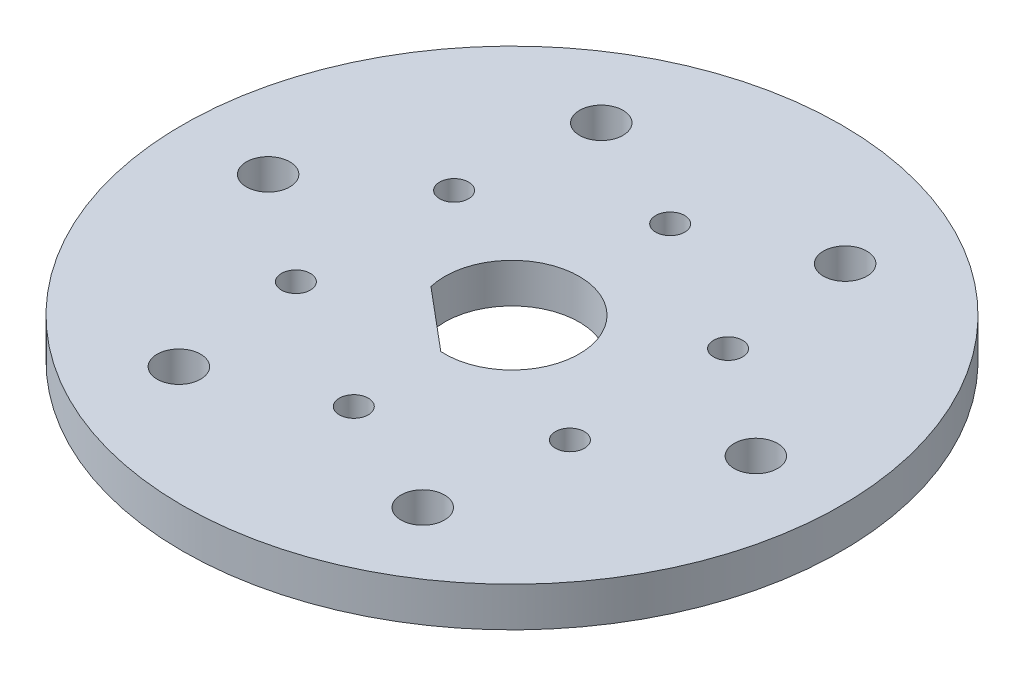
ISO-10303-21;
HEADER;
FILE_DESCRIPTION(('STEP AP214'),'2;1');
FILE_NAME('part.step','',(''),(''),'','','');
FILE_SCHEMA(('AUTOMOTIVE_DESIGN { 1 0 10303 214 1 1 1 1 }'));
ENDSEC;
DATA;
#1=APPLICATION_CONTEXT('core data for automotive mechanical design processes');
#2=APPLICATION_PROTOCOL_DEFINITION('international standard','automotive_design',2000,#1);
#3=PRODUCT_CONTEXT('',#1,'mechanical');
#4=PRODUCT('Part','Part','',(#3));
#5=PRODUCT_RELATED_PRODUCT_CATEGORY('part','',(#4));
#6=PRODUCT_DEFINITION_FORMATION('','',#4);
#7=PRODUCT_DEFINITION_CONTEXT('part definition',#1,'design');
#8=PRODUCT_DEFINITION('design','',#6,#7);
#9=PRODUCT_DEFINITION_SHAPE('','',#8);
#10=(LENGTH_UNIT() NAMED_UNIT(*) SI_UNIT(.MILLI.,.METRE.));
#11=(NAMED_UNIT(*) PLANE_ANGLE_UNIT() SI_UNIT($,.RADIAN.));
#12=(NAMED_UNIT(*) SI_UNIT($,.STERADIAN.) SOLID_ANGLE_UNIT());
#13=UNCERTAINTY_MEASURE_WITH_UNIT(LENGTH_MEASURE(1.E-05),#10,'distance_accuracy_value','');
#14=(GEOMETRIC_REPRESENTATION_CONTEXT(3) GLOBAL_UNCERTAINTY_ASSIGNED_CONTEXT((#13)) GLOBAL_UNIT_ASSIGNED_CONTEXT((#10,
#11,#12)) REPRESENTATION_CONTEXT('',''));
#15=CARTESIAN_POINT('',(0.,0.,0.));
#16=DIRECTION('',(0.,0.,1.));
#17=DIRECTION('',(1.,0.,0.));
#18=AXIS2_PLACEMENT_3D('',#15,#16,#17);
#19=CARTESIAN_POINT('',(0.,3.,0.));
#20=DIRECTION('',(0.,1.,0.));
#21=DIRECTION('',(0.,0.,1.));
#22=AXIS2_PLACEMENT_3D('',#19,#20,#21);
#23=PLANE('',#22);
#24=CARTESIAN_POINT('',(-10.3923048454127,3.,-5.99999999999955));
#25=DIRECTION('',(0.,1.,0.));
#26=DIRECTION('',(0.,0.,1.));
#27=AXIS2_PLACEMENT_3D('',#24,#25,#26);
#28=CIRCLE('',#27,1.1);
#29=CARTESIAN_POINT('',(-10.3923048454127,3.,-4.89999999999955));
#30=VERTEX_POINT('',#29);
#31=EDGE_CURVE('E121',#30,#30,#28,.T.);
#32=ORIENTED_EDGE('',*,*,#31,.F.);
#33=EDGE_LOOP('',(#32));
#34=FACE_BOUND('',#33,.T.);
#35=CARTESIAN_POINT('',(-10.3923048454121,3.,6.00000000000035));
#36=DIRECTION('',(0.,1.,0.));
#37=DIRECTION('',(0.,0.,1.));
#38=AXIS2_PLACEMENT_3D('',#35,#36,#37);
#39=CIRCLE('',#38,1.1);
#40=CARTESIAN_POINT('',(-10.3923048454121,3.,7.10000000000035));
#41=VERTEX_POINT('',#40);
#42=EDGE_CURVE('E125',#41,#41,#39,.T.);
#43=ORIENTED_EDGE('',*,*,#42,.F.);
#44=EDGE_LOOP('',(#43));
#45=FACE_BOUND('',#44,.T.);
#46=CARTESIAN_POINT('',(1.33226762955019E-12,3.,11.9999999999997));
#47=DIRECTION('',(0.,1.,0.));
#48=DIRECTION('',(0.,0.,1.));
#49=AXIS2_PLACEMENT_3D('',#46,#47,#48);
#50=CIRCLE('',#49,1.1);
#51=CARTESIAN_POINT('',(1.33226762955019E-12,3.,13.0999999999997));
#52=VERTEX_POINT('',#51);
#53=EDGE_CURVE('E129',#52,#52,#50,.T.);
#54=ORIENTED_EDGE('',*,*,#53,.F.);
#55=EDGE_LOOP('',(#54));
#56=FACE_BOUND('',#55,.T.);
#57=CARTESIAN_POINT('',(10.3923048454142,3.,5.99999999999924));
#58=DIRECTION('',(0.,1.,0.));
#59=DIRECTION('',(0.,0.,1.));
#60=AXIS2_PLACEMENT_3D('',#57,#58,#59);
#61=CIRCLE('',#60,1.1);
#62=CARTESIAN_POINT('',(10.3923048454142,3.,7.09999999999924));
#63=VERTEX_POINT('',#62);
#64=EDGE_CURVE('E133',#63,#63,#61,.T.);
#65=ORIENTED_EDGE('',*,*,#64,.F.);
#66=EDGE_LOOP('',(#65));
#67=FACE_BOUND('',#66,.T.);
#68=CARTESIAN_POINT('',(10.3923048454136,3.,-6.00000000000066));
#69=DIRECTION('',(0.,1.,0.));
#70=DIRECTION('',(0.,0.,1.));
#71=AXIS2_PLACEMENT_3D('',#68,#69,#70);
#72=CIRCLE('',#71,1.1);
#73=CARTESIAN_POINT('',(10.3923048454136,3.,-4.90000000000066));
#74=VERTEX_POINT('',#73);
#75=EDGE_CURVE('E75',#74,#74,#72,.T.);
#76=ORIENTED_EDGE('',*,*,#75,.F.);
#77=EDGE_LOOP('',(#76));
#78=FACE_BOUND('',#77,.T.);
#79=CARTESIAN_POINT('',(0.,3.,-12.));
#80=DIRECTION('',(0.,1.,0.));
#81=DIRECTION('',(0.,0.,1.));
#82=AXIS2_PLACEMENT_3D('',#79,#80,#81);
#83=CIRCLE('',#82,1.1);
#84=CARTESIAN_POINT('',(0.,3.,-10.9));
#85=VERTEX_POINT('',#84);
#86=EDGE_CURVE('E91',#85,#85,#83,.T.);
#87=ORIENTED_EDGE('',*,*,#86,.F.);
#88=EDGE_LOOP('',(#87));
#89=FACE_BOUND('',#88,.T.);
#90=CARTESIAN_POINT('',(0.,3.,0.));
#91=DIRECTION('',(0.,1.,0.));
#92=DIRECTION('',(0.,0.,1.));
#93=AXIS2_PLACEMENT_3D('',#90,#91,#92);
#94=CIRCLE('',#93,25.);
#95=CARTESIAN_POINT('',(0.,3.,25.));
#96=VERTEX_POINT('',#95);
#97=EDGE_CURVE('E11',#96,#96,#94,.T.);
#98=ORIENTED_EDGE('',*,*,#97,.T.);
#99=EDGE_LOOP('',(#98));
#100=FACE_BOUND('',#99,.T.);
#101=CARTESIAN_POINT('',(-9.25000000001397,3.,-16.0214699700021));
#102=DIRECTION('',(0.,1.,0.));
#103=DIRECTION('',(0.,0.,1.));
#104=AXIS2_PLACEMENT_3D('',#101,#102,#103);
#105=CIRCLE('',#104,1.65);
#106=CARTESIAN_POINT('',(-9.25000000001397,3.,-14.3714699700021));
#107=VERTEX_POINT('',#106);
#108=EDGE_CURVE('E85',#107,#107,#105,.T.);
#109=ORIENTED_EDGE('',*,*,#108,.F.);
#110=EDGE_LOOP('',(#109));
#111=FACE_BOUND('',#110,.T.);
#112=DIRECTION('',(0.766044443118973,0.,0.642787609686545));
#113=VECTOR('',#112,1.);
#114=CARTESIAN_POINT('',(-4.95895703842243,3.,1.19111086431126));
#115=LINE('',#114,#113);
#116=CARTESIAN_POINT('',(-4.95895703842243,3.,1.19111086431126));
#117=VERTEX_POINT('',#116);
#118=CARTESIAN_POINT('',(-0.311901361020173,3.,5.09045356927983));
#119=VERTEX_POINT('',#118);
#120=EDGE_CURVE('E81',#117,#119,#115,.T.);
#121=ORIENTED_EDGE('',*,*,#120,.F.);
#122=CARTESIAN_POINT('',(0.,3.,0.));
#123=DIRECTION('',(0.,1.,0.));
#124=DIRECTION('',(0.,0.,1.));
#125=AXIS2_PLACEMENT_3D('',#122,#123,#124);
#126=CIRCLE('',#125,5.09999999999998);
#127=EDGE_CURVE('E66',#119,#117,#126,.T.);
#128=ORIENTED_EDGE('',*,*,#127,.F.);
#129=EDGE_LOOP('',(#121,#128));
#130=FACE_BOUND('',#129,.T.);
#131=CARTESIAN_POINT('',(9.24999999998462,3.,-16.0214699700199));
#132=DIRECTION('',(0.,1.,0.));
#133=DIRECTION('',(0.,0.,1.));
#134=AXIS2_PLACEMENT_3D('',#131,#132,#133);
#135=CIRCLE('',#134,1.65);
#136=CARTESIAN_POINT('',(9.24999999998462,3.,-14.3714699700199));
#137=VERTEX_POINT('',#136);
#138=EDGE_CURVE('E146',#137,#137,#135,.T.);
#139=ORIENTED_EDGE('',*,*,#138,.F.);
#140=EDGE_LOOP('',(#139));
#141=FACE_BOUND('',#140,.T.);
#142=CARTESIAN_POINT('',(18.4999999999993,3.,-1.78329573330416E-11));
#143=DIRECTION('',(0.,1.,0.));
#144=DIRECTION('',(0.,0.,1.));
#145=AXIS2_PLACEMENT_3D('',#142,#143,#144);
#146=CIRCLE('',#145,1.65);
#147=CARTESIAN_POINT('',(18.4999999999993,3.,1.64999999998217));
#148=VERTEX_POINT('',#147);
#149=EDGE_CURVE('E150',#148,#148,#146,.T.);
#150=ORIENTED_EDGE('',*,*,#149,.F.);
#151=EDGE_LOOP('',(#150));
#152=FACE_BOUND('',#151,.T.);
#153=CARTESIAN_POINT('',(9.25000000001527,3.,16.0214699700019));
#154=DIRECTION('',(0.,1.,0.));
#155=DIRECTION('',(0.,0.,1.));
#156=AXIS2_PLACEMENT_3D('',#153,#154,#155);
#157=CIRCLE('',#156,1.65);
#158=CARTESIAN_POINT('',(9.25000000001527,3.,17.6714699700019));
#159=VERTEX_POINT('',#158);
#160=EDGE_CURVE('E154',#159,#159,#157,.T.);
#161=ORIENTED_EDGE('',*,*,#160,.F.);
#162=EDGE_LOOP('',(#161));
#163=FACE_BOUND('',#162,.T.);
#164=CARTESIAN_POINT('',(-9.24999999998327,3.,16.0214699700195));
#165=DIRECTION('',(0.,1.,0.));
#166=DIRECTION('',(0.,0.,1.));
#167=AXIS2_PLACEMENT_3D('',#164,#165,#166);
#168=CIRCLE('',#167,1.65);
#169=CARTESIAN_POINT('',(-9.24999999998327,3.,17.6714699700196));
#170=VERTEX_POINT('',#169);
#171=EDGE_CURVE('E158',#170,#170,#168,.T.);
#172=ORIENTED_EDGE('',*,*,#171,.F.);
#173=EDGE_LOOP('',(#172));
#174=FACE_BOUND('',#173,.T.);
#175=CARTESIAN_POINT('',(-18.4999999999978,3.,1.74721348500384E-11));
#176=DIRECTION('',(0.,1.,0.));
#177=DIRECTION('',(0.,0.,1.));
#178=AXIS2_PLACEMENT_3D('',#175,#176,#177);
#179=CIRCLE('',#178,1.65);
#180=CARTESIAN_POINT('',(-18.4999999999978,3.,1.65000000001747));
#181=VERTEX_POINT('',#180);
#182=EDGE_CURVE('E161',#181,#181,#179,.T.);
#183=ORIENTED_EDGE('',*,*,#182,.F.);
#184=EDGE_LOOP('',(#183));
#185=FACE_BOUND('',#184,.T.);
#186=ADVANCED_FACE('F34',(#34,#45,#56,#67,#78,#89,#100,#111,#130,#141,#152,#163,#174,#185),#23,.T.);
#187=CARTESIAN_POINT('',(0.,0.,0.));
#188=DIRECTION('',(0.,1.,0.));
#189=DIRECTION('',(0.,0.,1.));
#190=AXIS2_PLACEMENT_3D('',#187,#188,#189);
#191=PLANE('',#190);
#192=CARTESIAN_POINT('',(-9.25000000001397,0.,-16.0214699700021));
#193=DIRECTION('',(0.,1.,0.));
#194=DIRECTION('',(0.,0.,1.));
#195=AXIS2_PLACEMENT_3D('',#192,#193,#194);
#196=CIRCLE('',#195,1.65);
#197=CARTESIAN_POINT('',(-9.25000000001397,0.,-14.3714699700021));
#198=VERTEX_POINT('',#197);
#199=EDGE_CURVE('E71',#198,#198,#196,.T.);
#200=ORIENTED_EDGE('',*,*,#199,.T.);
#201=EDGE_LOOP('',(#200));
#202=FACE_BOUND('',#201,.T.);
#203=CARTESIAN_POINT('',(0.,0.,-12.));
#204=DIRECTION('',(0.,1.,0.));
#205=DIRECTION('',(0.,0.,1.));
#206=AXIS2_PLACEMENT_3D('',#203,#204,#205);
#207=CIRCLE('',#206,1.1);
#208=CARTESIAN_POINT('',(0.,0.,-10.9));
#209=VERTEX_POINT('',#208);
#210=EDGE_CURVE('E88',#209,#209,#207,.T.);
#211=ORIENTED_EDGE('',*,*,#210,.T.);
#212=EDGE_LOOP('',(#211));
#213=FACE_BOUND('',#212,.T.);
#214=CARTESIAN_POINT('',(0.,0.,0.));
#215=DIRECTION('',(0.,1.,0.));
#216=DIRECTION('',(0.,0.,1.));
#217=AXIS2_PLACEMENT_3D('',#214,#215,#216);
#218=CIRCLE('',#217,25.);
#219=CARTESIAN_POINT('',(0.,0.,25.));
#220=VERTEX_POINT('',#219);
#221=EDGE_CURVE('E38',#220,#220,#218,.T.);
#222=ORIENTED_EDGE('',*,*,#221,.F.);
#223=EDGE_LOOP('',(#222));
#224=FACE_BOUND('',#223,.T.);
#225=CARTESIAN_POINT('',(0.,0.,0.));
#226=DIRECTION('',(0.,1.,0.));
#227=DIRECTION('',(0.,0.,1.));
#228=AXIS2_PLACEMENT_3D('',#225,#226,#227);
#229=CIRCLE('',#228,5.09999999999998);
#230=CARTESIAN_POINT('',(-0.311901361020173,0.,5.09045356927983));
#231=VERTEX_POINT('',#230);
#232=CARTESIAN_POINT('',(-4.95895703842243,0.,1.19111086431126));
#233=VERTEX_POINT('',#232);
#234=EDGE_CURVE('E56',#231,#233,#229,.T.);
#235=ORIENTED_EDGE('',*,*,#234,.T.);
#236=DIRECTION('',(0.766044443118973,0.,0.642787609686545));
#237=VECTOR('',#236,1.);
#238=CARTESIAN_POINT('',(-4.95895703842243,0.,1.19111086431126));
#239=LINE('',#238,#237);
#240=EDGE_CURVE('E62',#233,#231,#239,.T.);
#241=ORIENTED_EDGE('',*,*,#240,.T.);
#242=EDGE_LOOP('',(#235,#241));
#243=FACE_BOUND('',#242,.T.);
#244=CARTESIAN_POINT('',(10.3923048454136,0.,-6.00000000000066));
#245=DIRECTION('',(0.,1.,0.));
#246=DIRECTION('',(0.,0.,1.));
#247=AXIS2_PLACEMENT_3D('',#244,#245,#246);
#248=CIRCLE('',#247,1.1);
#249=CARTESIAN_POINT('',(10.3923048454136,0.,-4.90000000000066));
#250=VERTEX_POINT('',#249);
#251=EDGE_CURVE('E78',#250,#250,#248,.T.);
#252=ORIENTED_EDGE('',*,*,#251,.T.);
#253=EDGE_LOOP('',(#252));
#254=FACE_BOUND('',#253,.T.);
#255=CARTESIAN_POINT('',(9.24999999998462,0.,-16.0214699700199));
#256=DIRECTION('',(0.,1.,0.));
#257=DIRECTION('',(0.,0.,1.));
#258=AXIS2_PLACEMENT_3D('',#255,#256,#257);
#259=CIRCLE('',#258,1.65);
#260=CARTESIAN_POINT('',(9.24999999998462,0.,-14.3714699700199));
#261=VERTEX_POINT('',#260);
#262=EDGE_CURVE('E194',#261,#261,#259,.T.);
#263=ORIENTED_EDGE('',*,*,#262,.T.);
#264=EDGE_LOOP('',(#263));
#265=FACE_BOUND('',#264,.T.);
#266=CARTESIAN_POINT('',(10.3923048454142,0.,5.99999999999924));
#267=DIRECTION('',(0.,1.,0.));
#268=DIRECTION('',(0.,0.,1.));
#269=AXIS2_PLACEMENT_3D('',#266,#267,#268);
#270=CIRCLE('',#269,1.1);
#271=CARTESIAN_POINT('',(10.3923048454142,0.,7.09999999999924));
#272=VERTEX_POINT('',#271);
#273=EDGE_CURVE('E190',#272,#272,#270,.T.);
#274=ORIENTED_EDGE('',*,*,#273,.T.);
#275=EDGE_LOOP('',(#274));
#276=FACE_BOUND('',#275,.T.);
#277=CARTESIAN_POINT('',(18.4999999999993,0.,-1.78329573330416E-11));
#278=DIRECTION('',(0.,1.,0.));
#279=DIRECTION('',(0.,0.,1.));
#280=AXIS2_PLACEMENT_3D('',#277,#278,#279);
#281=CIRCLE('',#280,1.65);
#282=CARTESIAN_POINT('',(18.4999999999993,0.,1.64999999998217));
#283=VERTEX_POINT('',#282);
#284=EDGE_CURVE('E186',#283,#283,#281,.T.);
#285=ORIENTED_EDGE('',*,*,#284,.T.);
#286=EDGE_LOOP('',(#285));
#287=FACE_BOUND('',#286,.T.);
#288=CARTESIAN_POINT('',(1.33226762955019E-12,0.,11.9999999999997));
#289=DIRECTION('',(0.,1.,0.));
#290=DIRECTION('',(0.,0.,1.));
#291=AXIS2_PLACEMENT_3D('',#288,#289,#290);
#292=CIRCLE('',#291,1.1);
#293=CARTESIAN_POINT('',(1.33226762955019E-12,0.,13.0999999999997));
#294=VERTEX_POINT('',#293);
#295=EDGE_CURVE('E182',#294,#294,#292,.T.);
#296=ORIENTED_EDGE('',*,*,#295,.T.);
#297=EDGE_LOOP('',(#296));
#298=FACE_BOUND('',#297,.T.);
#299=CARTESIAN_POINT('',(9.25000000001527,0.,16.0214699700019));
#300=DIRECTION('',(0.,1.,0.));
#301=DIRECTION('',(0.,0.,1.));
#302=AXIS2_PLACEMENT_3D('',#299,#300,#301);
#303=CIRCLE('',#302,1.65);
#304=CARTESIAN_POINT('',(9.25000000001527,0.,17.6714699700019));
#305=VERTEX_POINT('',#304);
#306=EDGE_CURVE('E178',#305,#305,#303,.T.);
#307=ORIENTED_EDGE('',*,*,#306,.T.);
#308=EDGE_LOOP('',(#307));
#309=FACE_BOUND('',#308,.T.);
#310=CARTESIAN_POINT('',(-10.3923048454121,0.,6.00000000000035));
#311=DIRECTION('',(0.,1.,0.));
#312=DIRECTION('',(0.,0.,1.));
#313=AXIS2_PLACEMENT_3D('',#310,#311,#312);
#314=CIRCLE('',#313,1.1);
#315=CARTESIAN_POINT('',(-10.3923048454121,0.,7.10000000000035));
#316=VERTEX_POINT('',#315);
#317=EDGE_CURVE('E174',#316,#316,#314,.T.);
#318=ORIENTED_EDGE('',*,*,#317,.T.);
#319=EDGE_LOOP('',(#318));
#320=FACE_BOUND('',#319,.T.);
#321=CARTESIAN_POINT('',(-9.24999999998327,0.,16.0214699700195));
#322=DIRECTION('',(0.,1.,0.));
#323=DIRECTION('',(0.,0.,1.));
#324=AXIS2_PLACEMENT_3D('',#321,#322,#323);
#325=CIRCLE('',#324,1.65);
#326=CARTESIAN_POINT('',(-9.24999999998327,0.,17.6714699700196));
#327=VERTEX_POINT('',#326);
#328=EDGE_CURVE('E171',#327,#327,#325,.T.);
#329=ORIENTED_EDGE('',*,*,#328,.T.);
#330=EDGE_LOOP('',(#329));
#331=FACE_BOUND('',#330,.T.);
#332=CARTESIAN_POINT('',(-10.3923048454127,0.,-5.99999999999955));
#333=DIRECTION('',(0.,1.,0.));
#334=DIRECTION('',(0.,0.,1.));
#335=AXIS2_PLACEMENT_3D('',#332,#333,#334);
#336=CIRCLE('',#335,1.1);
#337=CARTESIAN_POINT('',(-10.3923048454127,0.,-4.89999999999955));
#338=VERTEX_POINT('',#337);
#339=EDGE_CURVE('E163',#338,#338,#336,.T.);
#340=ORIENTED_EDGE('',*,*,#339,.T.);
#341=EDGE_LOOP('',(#340));
#342=FACE_BOUND('',#341,.T.);
#343=CARTESIAN_POINT('',(-18.4999999999978,0.,1.74721348500384E-11));
#344=DIRECTION('',(0.,1.,0.));
#345=DIRECTION('',(0.,0.,1.));
#346=AXIS2_PLACEMENT_3D('',#343,#344,#345);
#347=CIRCLE('',#346,1.65);
#348=CARTESIAN_POINT('',(-18.4999999999978,0.,1.65000000001747));
#349=VERTEX_POINT('',#348);
#350=EDGE_CURVE('E164',#349,#349,#347,.T.);
#351=ORIENTED_EDGE('',*,*,#350,.T.);
#352=EDGE_LOOP('',(#351));
#353=FACE_BOUND('',#352,.T.);
#354=ADVANCED_FACE('F73',(#202,#213,#224,#243,#254,#265,#276,#287,#298,#309,#320,#331,#342,
#353),#191,.F.);
#355=CARTESIAN_POINT('',(0.,3.,0.));
#356=DIRECTION('',(0.,-1.,0.));
#357=DIRECTION('',(0.,0.,-1.));
#358=AXIS2_PLACEMENT_3D('',#355,#356,#357);
#359=CYLINDRICAL_SURFACE('',#358,25.);
#360=ORIENTED_EDGE('',*,*,#97,.F.);
#361=EDGE_LOOP('',(#360));
#362=FACE_BOUND('',#361,.T.);
#363=ORIENTED_EDGE('',*,*,#221,.T.);
#364=EDGE_LOOP('',(#363));
#365=FACE_BOUND('',#364,.T.);
#366=ADVANCED_FACE('F36',(#362,#365),#359,.T.);
#367=CARTESIAN_POINT('',(0.,3.,-12.));
#368=DIRECTION('',(0.,-1.,0.));
#369=DIRECTION('',(0.,0.,-1.));
#370=AXIS2_PLACEMENT_3D('',#367,#368,#369);
#371=CYLINDRICAL_SURFACE('',#370,1.1);
#372=ORIENTED_EDGE('',*,*,#86,.T.);
#373=EDGE_LOOP('',(#372));
#374=FACE_BOUND('',#373,.T.);
#375=ORIENTED_EDGE('',*,*,#210,.F.);
#376=EDGE_LOOP('',(#375));
#377=FACE_BOUND('',#376,.T.);
#378=ADVANCED_FACE('F99',(#374,#377),#371,.F.);
#379=CARTESIAN_POINT('',(-9.25000000001397,3.,-16.0214699700021));
#380=DIRECTION('',(0.,-1.,0.));
#381=DIRECTION('',(0.,0.,-1.));
#382=AXIS2_PLACEMENT_3D('',#379,#380,#381);
#383=CYLINDRICAL_SURFACE('',#382,1.65);
#384=ORIENTED_EDGE('',*,*,#108,.T.);
#385=EDGE_LOOP('',(#384));
#386=FACE_BOUND('',#385,.T.);
#387=ORIENTED_EDGE('',*,*,#199,.F.);
#388=EDGE_LOOP('',(#387));
#389=FACE_BOUND('',#388,.T.);
#390=ADVANCED_FACE('F101',(#386,#389),#383,.F.);
#391=CARTESIAN_POINT('',(0.,3.,0.));
#392=DIRECTION('',(0.,-1.,0.));
#393=DIRECTION('',(0.,0.,-1.));
#394=AXIS2_PLACEMENT_3D('',#391,#392,#393);
#395=CYLINDRICAL_SURFACE('',#394,5.09999999999998);
#396=ORIENTED_EDGE('',*,*,#234,.F.);
#397=DIRECTION('',(0.,-1.,0.));
#398=VECTOR('',#397,1.);
#399=CARTESIAN_POINT('',(-0.311901361020173,3.,5.09045356927983));
#400=LINE('',#399,#398);
#401=EDGE_CURVE('E64',#119,#231,#400,.T.);
#402=ORIENTED_EDGE('',*,*,#401,.F.);
#403=ORIENTED_EDGE('',*,*,#127,.T.);
#404=DIRECTION('',(0.,-1.,0.));
#405=VECTOR('',#404,1.);
#406=CARTESIAN_POINT('',(-4.95895703842243,3.,1.19111086431126));
#407=LINE('',#406,#405);
#408=EDGE_CURVE('E49',#117,#233,#407,.T.);
#409=ORIENTED_EDGE('',*,*,#408,.T.);
#410=EDGE_LOOP('',(#396,#402,#403,#409));
#411=FACE_BOUND('',#410,.T.);
#412=ADVANCED_FACE('F68',(#411),#395,.F.);
#413=CARTESIAN_POINT('',(-4.95895703842243,3.,1.19111086431126));
#414=DIRECTION('',(0.642787609686545,0.,-0.766044443118973));
#415=DIRECTION('',(-0.766044443118973,0.,-0.642787609686545));
#416=AXIS2_PLACEMENT_3D('',#413,#414,#415);
#417=PLANE('',#416);
#418=ORIENTED_EDGE('',*,*,#240,.F.);
#419=ORIENTED_EDGE('',*,*,#408,.F.);
#420=ORIENTED_EDGE('',*,*,#120,.T.);
#421=ORIENTED_EDGE('',*,*,#401,.T.);
#422=EDGE_LOOP('',(#418,#419,#420,#421));
#423=FACE_BOUND('',#422,.T.);
#424=ADVANCED_FACE('F63',(#423),#417,.T.);
#425=CARTESIAN_POINT('',(10.3923048454136,3.,-6.00000000000066));
#426=DIRECTION('',(0.,-1.,0.));
#427=DIRECTION('',(0.,0.,-1.));
#428=AXIS2_PLACEMENT_3D('',#425,#426,#427);
#429=CYLINDRICAL_SURFACE('',#428,1.1);
#430=ORIENTED_EDGE('',*,*,#75,.T.);
#431=EDGE_LOOP('',(#430));
#432=FACE_BOUND('',#431,.T.);
#433=ORIENTED_EDGE('',*,*,#251,.F.);
#434=EDGE_LOOP('',(#433));
#435=FACE_BOUND('',#434,.T.);
#436=ADVANCED_FACE('F204',(#432,#435),#429,.F.);
#437=CARTESIAN_POINT('',(9.24999999998462,3.,-16.0214699700199));
#438=DIRECTION('',(0.,-1.,0.));
#439=DIRECTION('',(0.,0.,-1.));
#440=AXIS2_PLACEMENT_3D('',#437,#438,#439);
#441=CYLINDRICAL_SURFACE('',#440,1.65);
#442=ORIENTED_EDGE('',*,*,#138,.T.);
#443=EDGE_LOOP('',(#442));
#444=FACE_BOUND('',#443,.T.);
#445=ORIENTED_EDGE('',*,*,#262,.F.);
#446=EDGE_LOOP('',(#445));
#447=FACE_BOUND('',#446,.T.);
#448=ADVANCED_FACE('F206',(#444,#447),#441,.F.);
#449=CARTESIAN_POINT('',(10.3923048454142,3.,5.99999999999924));
#450=DIRECTION('',(0.,-1.,0.));
#451=DIRECTION('',(0.,0.,-1.));
#452=AXIS2_PLACEMENT_3D('',#449,#450,#451);
#453=CYLINDRICAL_SURFACE('',#452,1.1);
#454=ORIENTED_EDGE('',*,*,#64,.T.);
#455=EDGE_LOOP('',(#454));
#456=FACE_BOUND('',#455,.T.);
#457=ORIENTED_EDGE('',*,*,#273,.F.);
#458=EDGE_LOOP('',(#457));
#459=FACE_BOUND('',#458,.T.);
#460=ADVANCED_FACE('F213',(#456,#459),#453,.F.);
#461=CARTESIAN_POINT('',(18.4999999999993,3.,-1.78329573330416E-11));
#462=DIRECTION('',(0.,-1.,0.));
#463=DIRECTION('',(0.,0.,-1.));
#464=AXIS2_PLACEMENT_3D('',#461,#462,#463);
#465=CYLINDRICAL_SURFACE('',#464,1.65);
#466=ORIENTED_EDGE('',*,*,#149,.T.);
#467=EDGE_LOOP('',(#466));
#468=FACE_BOUND('',#467,.T.);
#469=ORIENTED_EDGE('',*,*,#284,.F.);
#470=EDGE_LOOP('',(#469));
#471=FACE_BOUND('',#470,.T.);
#472=ADVANCED_FACE('F247',(#468,#471),#465,.F.);
#473=CARTESIAN_POINT('',(1.33226762955019E-12,3.,11.9999999999997));
#474=DIRECTION('',(0.,-1.,0.));
#475=DIRECTION('',(0.,0.,-1.));
#476=AXIS2_PLACEMENT_3D('',#473,#474,#475);
#477=CYLINDRICAL_SURFACE('',#476,1.1);
#478=ORIENTED_EDGE('',*,*,#53,.T.);
#479=EDGE_LOOP('',(#478));
#480=FACE_BOUND('',#479,.T.);
#481=ORIENTED_EDGE('',*,*,#295,.F.);
#482=EDGE_LOOP('',(#481));
#483=FACE_BOUND('',#482,.T.);
#484=ADVANCED_FACE('F256',(#480,#483),#477,.F.);
#485=CARTESIAN_POINT('',(9.25000000001527,3.,16.0214699700019));
#486=DIRECTION('',(0.,-1.,0.));
#487=DIRECTION('',(0.,0.,-1.));
#488=AXIS2_PLACEMENT_3D('',#485,#486,#487);
#489=CYLINDRICAL_SURFACE('',#488,1.65);
#490=ORIENTED_EDGE('',*,*,#160,.T.);
#491=EDGE_LOOP('',(#490));
#492=FACE_BOUND('',#491,.T.);
#493=ORIENTED_EDGE('',*,*,#306,.F.);
#494=EDGE_LOOP('',(#493));
#495=FACE_BOUND('',#494,.T.);
#496=ADVANCED_FACE('F266',(#492,#495),#489,.F.);
#497=CARTESIAN_POINT('',(-10.3923048454121,3.,6.00000000000035));
#498=DIRECTION('',(0.,-1.,0.));
#499=DIRECTION('',(0.,0.,-1.));
#500=AXIS2_PLACEMENT_3D('',#497,#498,#499);
#501=CYLINDRICAL_SURFACE('',#500,1.1);
#502=ORIENTED_EDGE('',*,*,#42,.T.);
#503=EDGE_LOOP('',(#502));
#504=FACE_BOUND('',#503,.T.);
#505=ORIENTED_EDGE('',*,*,#317,.F.);
#506=EDGE_LOOP('',(#505));
#507=FACE_BOUND('',#506,.T.);
#508=ADVANCED_FACE('F276',(#504,#507),#501,.F.);
#509=CARTESIAN_POINT('',(-9.24999999998327,3.,16.0214699700195));
#510=DIRECTION('',(0.,-1.,0.));
#511=DIRECTION('',(0.,0.,-1.));
#512=AXIS2_PLACEMENT_3D('',#509,#510,#511);
#513=CYLINDRICAL_SURFACE('',#512,1.65);
#514=ORIENTED_EDGE('',*,*,#171,.T.);
#515=EDGE_LOOP('',(#514));
#516=FACE_BOUND('',#515,.T.);
#517=ORIENTED_EDGE('',*,*,#328,.F.);
#518=EDGE_LOOP('',(#517));
#519=FACE_BOUND('',#518,.T.);
#520=ADVANCED_FACE('F286',(#516,#519),#513,.F.);
#521=CARTESIAN_POINT('',(-10.3923048454127,3.,-5.99999999999955));
#522=DIRECTION('',(0.,-1.,0.));
#523=DIRECTION('',(0.,0.,-1.));
#524=AXIS2_PLACEMENT_3D('',#521,#522,#523);
#525=CYLINDRICAL_SURFACE('',#524,1.1);
#526=ORIENTED_EDGE('',*,*,#31,.T.);
#527=EDGE_LOOP('',(#526));
#528=FACE_BOUND('',#527,.T.);
#529=ORIENTED_EDGE('',*,*,#339,.F.);
#530=EDGE_LOOP('',(#529));
#531=FACE_BOUND('',#530,.T.);
#532=ADVANCED_FACE('F296',(#528,#531),#525,.F.);
#533=CARTESIAN_POINT('',(-18.4999999999978,3.,1.74721348500384E-11));
#534=DIRECTION('',(0.,-1.,0.));
#535=DIRECTION('',(0.,0.,-1.));
#536=AXIS2_PLACEMENT_3D('',#533,#534,#535);
#537=CYLINDRICAL_SURFACE('',#536,1.65);
#538=ORIENTED_EDGE('',*,*,#182,.T.);
#539=EDGE_LOOP('',(#538));
#540=FACE_BOUND('',#539,.T.);
#541=ORIENTED_EDGE('',*,*,#350,.F.);
#542=EDGE_LOOP('',(#541));
#543=FACE_BOUND('',#542,.T.);
#544=ADVANCED_FACE('F306',(#540,#543),#537,.F.);
#545=CLOSED_SHELL('',(#186,#354,#366,#378,#390,#412,#424,#436,#448,#460,#472,#484,#496,#508,
#520,#532,#544));
#546=MANIFOLD_SOLID_BREP('B2',#545);
#547=ADVANCED_BREP_SHAPE_REPRESENTATION('',(#18,#546),#14);
#548=SHAPE_DEFINITION_REPRESENTATION(#9,#547);
ENDSEC;
END-ISO-10303-21;
